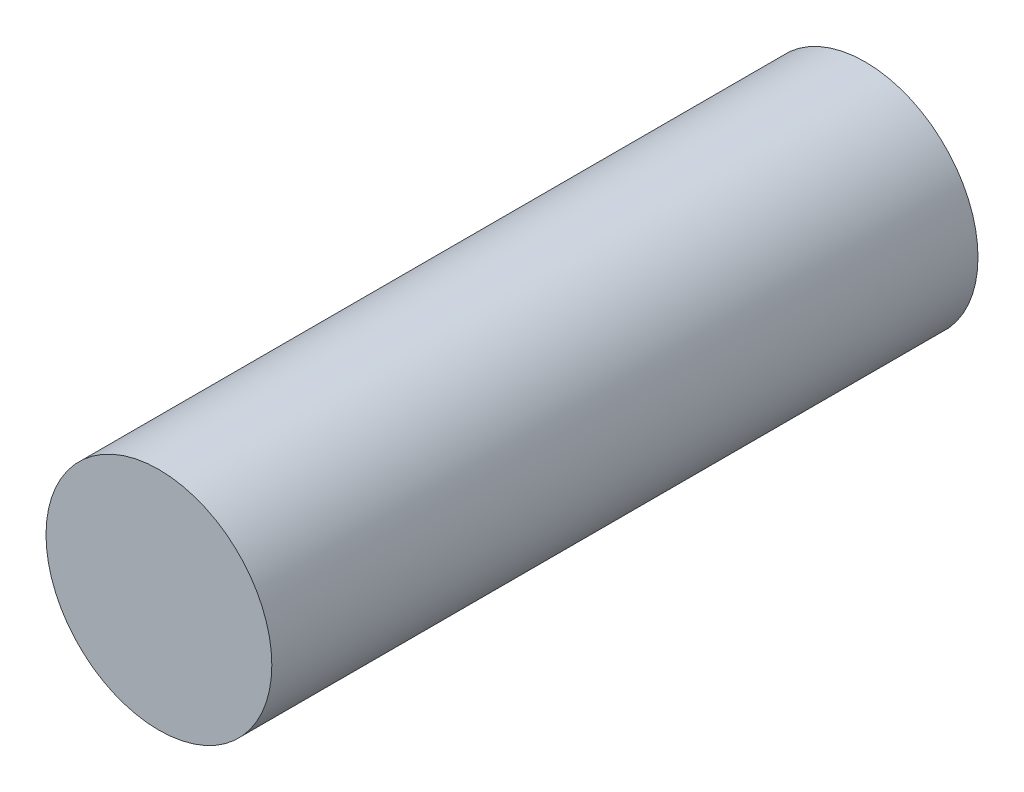
ISO-10303-21;
HEADER;
FILE_DESCRIPTION(('STEP AP214'),'2;1');
FILE_NAME('part.step','',(''),(''),'','','');
FILE_SCHEMA(('AUTOMOTIVE_DESIGN { 1 0 10303 214 1 1 1 1 }'));
ENDSEC;
DATA;
#1=APPLICATION_CONTEXT('core data for automotive mechanical design processes');
#2=APPLICATION_PROTOCOL_DEFINITION('international standard','automotive_design',2000,#1);
#3=PRODUCT_CONTEXT('',#1,'mechanical');
#4=PRODUCT('Part','Part','',(#3));
#5=PRODUCT_RELATED_PRODUCT_CATEGORY('part','',(#4));
#6=PRODUCT_DEFINITION_FORMATION('','',#4);
#7=PRODUCT_DEFINITION_CONTEXT('part definition',#1,'design');
#8=PRODUCT_DEFINITION('design','',#6,#7);
#9=PRODUCT_DEFINITION_SHAPE('','',#8);
#10=(LENGTH_UNIT() NAMED_UNIT(*) SI_UNIT(.MILLI.,.METRE.));
#11=(NAMED_UNIT(*) PLANE_ANGLE_UNIT() SI_UNIT($,.RADIAN.));
#12=(NAMED_UNIT(*) SI_UNIT($,.STERADIAN.) SOLID_ANGLE_UNIT());
#13=UNCERTAINTY_MEASURE_WITH_UNIT(LENGTH_MEASURE(1.E-05),#10,'distance_accuracy_value','');
#14=(GEOMETRIC_REPRESENTATION_CONTEXT(3) GLOBAL_UNCERTAINTY_ASSIGNED_CONTEXT((#13)) GLOBAL_UNIT_ASSIGNED_CONTEXT((#10,
#11,#12)) REPRESENTATION_CONTEXT('',''));
#15=CARTESIAN_POINT('',(0.,0.,0.));
#16=DIRECTION('',(0.,0.,1.));
#17=DIRECTION('',(1.,0.,0.));
#18=AXIS2_PLACEMENT_3D('',#15,#16,#17);
#19=CARTESIAN_POINT('',(0.,0.,6.2357));
#20=DIRECTION('',(0.,0.,-1.));
#21=DIRECTION('',(-1.,0.,0.));
#22=AXIS2_PLACEMENT_3D('',#19,#20,#21);
#23=CYLINDRICAL_SURFACE('',#22,1.9939);
#24=CARTESIAN_POINT('',(0.,0.,6.2357));
#25=DIRECTION('',(0.,0.,1.));
#26=DIRECTION('',(1.,0.,0.));
#27=AXIS2_PLACEMENT_3D('',#24,#25,#26);
#28=CIRCLE('',#27,1.9939);
#29=CARTESIAN_POINT('',(1.9939,0.,6.2357));
#30=VERTEX_POINT('',#29);
#31=EDGE_CURVE('E10',#30,#30,#28,.T.);
#32=ORIENTED_EDGE('',*,*,#31,.F.);
#33=EDGE_LOOP('',(#32));
#34=FACE_BOUND('',#33,.T.);
#35=CARTESIAN_POINT('',(0.,0.,-6.2357));
#36=DIRECTION('',(0.,0.,1.));
#37=DIRECTION('',(1.,0.,0.));
#38=AXIS2_PLACEMENT_3D('',#35,#36,#37);
#39=CIRCLE('',#38,1.9939);
#40=CARTESIAN_POINT('',(1.9939,0.,-6.2357));
#41=VERTEX_POINT('',#40);
#42=EDGE_CURVE('E34',#41,#41,#39,.T.);
#43=ORIENTED_EDGE('',*,*,#42,.T.);
#44=EDGE_LOOP('',(#43));
#45=FACE_BOUND('',#44,.T.);
#46=ADVANCED_FACE('F31',(#34,#45),#23,.T.);
#47=CARTESIAN_POINT('',(0.,0.,6.2357));
#48=DIRECTION('',(0.,0.,1.));
#49=DIRECTION('',(1.,0.,0.));
#50=AXIS2_PLACEMENT_3D('',#47,#48,#49);
#51=PLANE('',#50);
#52=ORIENTED_EDGE('',*,*,#31,.T.);
#53=EDGE_LOOP('',(#52));
#54=FACE_BOUND('',#53,.T.);
#55=ADVANCED_FACE('F46',(#54),#51,.T.);
#56=CARTESIAN_POINT('',(0.,0.,-6.2357));
#57=DIRECTION('',(0.,0.,1.));
#58=DIRECTION('',(1.,0.,0.));
#59=AXIS2_PLACEMENT_3D('',#56,#57,#58);
#60=PLANE('',#59);
#61=ORIENTED_EDGE('',*,*,#42,.F.);
#62=EDGE_LOOP('',(#61));
#63=FACE_BOUND('',#62,.T.);
#64=ADVANCED_FACE('F44',(#63),#60,.F.);
#65=CLOSED_SHELL('',(#46,#55,#64));
#66=MANIFOLD_SOLID_BREP('B2',#65);
#67=ADVANCED_BREP_SHAPE_REPRESENTATION('',(#18,#66),#14);
#68=SHAPE_DEFINITION_REPRESENTATION(#9,#67);
ENDSEC;
END-ISO-10303-21;
